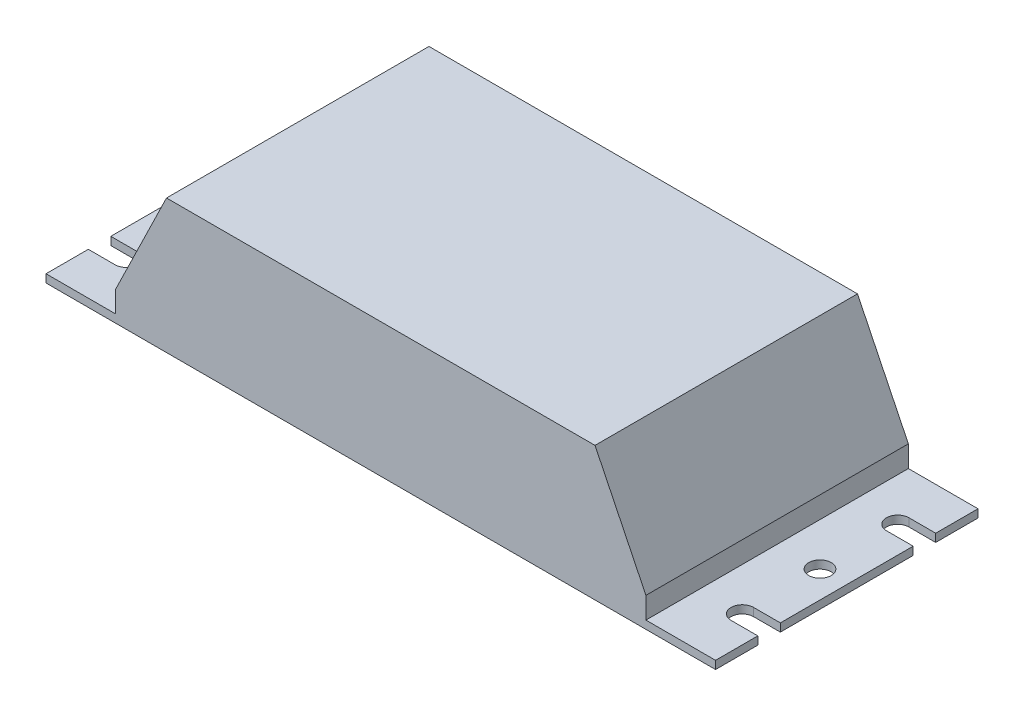
ISO-10303-21;
HEADER;
FILE_DESCRIPTION(('STEP AP214'),'2;1');
FILE_NAME('part.step','',(''),(''),'','','');
FILE_SCHEMA(('AUTOMOTIVE_DESIGN { 1 0 10303 214 1 1 1 1 }'));
ENDSEC;
DATA;
#1=APPLICATION_CONTEXT('core data for automotive mechanical design processes');
#2=APPLICATION_PROTOCOL_DEFINITION('international standard','automotive_design',2000,#1);
#3=PRODUCT_CONTEXT('',#1,'mechanical');
#4=PRODUCT('Part','Part','',(#3));
#5=PRODUCT_RELATED_PRODUCT_CATEGORY('part','',(#4));
#6=PRODUCT_DEFINITION_FORMATION('','',#4);
#7=PRODUCT_DEFINITION_CONTEXT('part definition',#1,'design');
#8=PRODUCT_DEFINITION('design','',#6,#7);
#9=PRODUCT_DEFINITION_SHAPE('','',#8);
#10=(LENGTH_UNIT() NAMED_UNIT(*) SI_UNIT(.MILLI.,.METRE.));
#11=(NAMED_UNIT(*) PLANE_ANGLE_UNIT() SI_UNIT($,.RADIAN.));
#12=(NAMED_UNIT(*) SI_UNIT($,.STERADIAN.) SOLID_ANGLE_UNIT());
#13=UNCERTAINTY_MEASURE_WITH_UNIT(LENGTH_MEASURE(1.E-05),#10,'distance_accuracy_value','');
#14=(GEOMETRIC_REPRESENTATION_CONTEXT(3) GLOBAL_UNCERTAINTY_ASSIGNED_CONTEXT((#13)) GLOBAL_UNIT_ASSIGNED_CONTEXT((#10,
#11,#12)) REPRESENTATION_CONTEXT('',''));
#15=CARTESIAN_POINT('',(0.,0.,0.));
#16=DIRECTION('',(0.,0.,1.));
#17=DIRECTION('',(1.,0.,0.));
#18=AXIS2_PLACEMENT_3D('',#15,#16,#17);
#19=CARTESIAN_POINT('',(-62.5,25.,-24.5));
#20=DIRECTION('',(1.,0.,0.));
#21=DIRECTION('',(0.,0.,-1.));
#22=AXIS2_PLACEMENT_3D('',#19,#20,#21);
#23=PLANE('',#22);
#24=DIRECTION('',(0.,0.,1.));
#25=VECTOR('',#24,1.);
#26=CARTESIAN_POINT('',(-62.5,0.,-24.5));
#27=LINE('',#26,#25);
#28=CARTESIAN_POINT('',(-62.5,0.,-24.5));
#29=VERTEX_POINT('',#28);
#30=CARTESIAN_POINT('',(-62.5,0.,-16.6));
#31=VERTEX_POINT('',#30);
#32=EDGE_CURVE('E360',#29,#31,#27,.T.);
#33=ORIENTED_EDGE('',*,*,#32,.T.);
#34=DIRECTION('',(0.,-1.,0.));
#35=VECTOR('',#34,1.);
#36=CARTESIAN_POINT('',(-62.5,25.,-16.6));
#37=LINE('',#36,#35);
#38=CARTESIAN_POINT('',(-62.5,1.5,-16.6));
#39=VERTEX_POINT('',#38);
#40=EDGE_CURVE('E234',#39,#31,#37,.T.);
#41=ORIENTED_EDGE('',*,*,#40,.F.);
#42=DIRECTION('',(0.,0.,1.));
#43=VECTOR('',#42,1.);
#44=CARTESIAN_POINT('',(-62.5,1.5,-24.5));
#45=LINE('',#44,#43);
#46=CARTESIAN_POINT('',(-62.5,1.5,-24.5));
#47=VERTEX_POINT('',#46);
#48=EDGE_CURVE('E329',#47,#39,#45,.T.);
#49=ORIENTED_EDGE('',*,*,#48,.F.);
#50=DIRECTION('',(0.,-1.,0.));
#51=VECTOR('',#50,1.);
#52=CARTESIAN_POINT('',(-62.5,25.,-24.5));
#53=LINE('',#52,#51);
#54=EDGE_CURVE('E359',#47,#29,#53,.T.);
#55=ORIENTED_EDGE('',*,*,#54,.T.);
#56=EDGE_LOOP('',(#33,#41,#49,#55));
#57=FACE_BOUND('',#56,.T.);
#58=ADVANCED_FACE('F36',(#57),#23,.F.);
#59=CARTESIAN_POINT('',(62.5,25.,-24.5));
#60=DIRECTION('',(-1.,0.,0.));
#61=DIRECTION('',(0.,0.,1.));
#62=AXIS2_PLACEMENT_3D('',#59,#60,#61);
#63=PLANE('',#62);
#64=DIRECTION('',(0.,0.,-1.));
#65=VECTOR('',#64,1.);
#66=CARTESIAN_POINT('',(62.5,0.,-24.5));
#67=LINE('',#66,#65);
#68=CARTESIAN_POINT('',(62.5,0.,12.4));
#69=VERTEX_POINT('',#68);
#70=CARTESIAN_POINT('',(62.5,0.,-12.4));
#71=VERTEX_POINT('',#70);
#72=EDGE_CURVE('E370',#69,#71,#67,.T.);
#73=ORIENTED_EDGE('',*,*,#72,.T.);
#74=DIRECTION('',(0.,-1.,0.));
#75=VECTOR('',#74,1.);
#76=CARTESIAN_POINT('',(62.5,25.,-12.4));
#77=LINE('',#76,#75);
#78=CARTESIAN_POINT('',(62.5,1.5,-12.4));
#79=VERTEX_POINT('',#78);
#80=EDGE_CURVE('E248',#79,#71,#77,.T.);
#81=ORIENTED_EDGE('',*,*,#80,.F.);
#82=DIRECTION('',(0.,0.,1.));
#83=VECTOR('',#82,1.);
#84=CARTESIAN_POINT('',(62.5,1.5,-24.5));
#85=LINE('',#84,#83);
#86=CARTESIAN_POINT('',(62.5,1.5,12.4));
#87=VERTEX_POINT('',#86);
#88=EDGE_CURVE('E351',#79,#87,#85,.T.);
#89=ORIENTED_EDGE('',*,*,#88,.T.);
#90=DIRECTION('',(0.,-1.,0.));
#91=VECTOR('',#90,1.);
#92=CARTESIAN_POINT('',(62.5,25.,12.4));
#93=LINE('',#92,#91);
#94=EDGE_CURVE('E265',#87,#69,#93,.T.);
#95=ORIENTED_EDGE('',*,*,#94,.T.);
#96=EDGE_LOOP('',(#73,#81,#89,#95));
#97=FACE_BOUND('',#96,.T.);
#98=ADVANCED_FACE('F432',(#97),#63,.F.);
#99=CARTESIAN_POINT('',(62.5,0.,24.5));
#100=VERTEX_POINT('',#99);
#101=CARTESIAN_POINT('',(62.5,0.,16.6));
#102=VERTEX_POINT('',#101);
#103=EDGE_CURVE('E367',#100,#102,#67,.T.);
#104=ORIENTED_EDGE('',*,*,#103,.T.);
#105=DIRECTION('',(0.,-1.,0.));
#106=VECTOR('',#105,1.);
#107=CARTESIAN_POINT('',(62.5,25.,16.6));
#108=LINE('',#107,#106);
#109=CARTESIAN_POINT('',(62.5,1.5,16.6));
#110=VERTEX_POINT('',#109);
#111=EDGE_CURVE('E263',#110,#102,#108,.T.);
#112=ORIENTED_EDGE('',*,*,#111,.F.);
#113=CARTESIAN_POINT('',(62.5,1.5,24.5));
#114=VERTEX_POINT('',#113);
#115=EDGE_CURVE('E311',#110,#114,#85,.T.);
#116=ORIENTED_EDGE('',*,*,#115,.T.);
#117=DIRECTION('',(0.,-1.,0.));
#118=VECTOR('',#117,1.);
#119=CARTESIAN_POINT('',(62.5,25.,24.5));
#120=LINE('',#119,#118);
#121=EDGE_CURVE('E377',#114,#100,#120,.T.);
#122=ORIENTED_EDGE('',*,*,#121,.T.);
#123=EDGE_LOOP('',(#104,#112,#116,#122));
#124=FACE_BOUND('',#123,.T.);
#125=ADVANCED_FACE('F452',(#124),#63,.F.);
#126=CARTESIAN_POINT('',(-62.5,1.5,16.6));
#127=VERTEX_POINT('',#126);
#128=CARTESIAN_POINT('',(-62.5,1.5,24.5));
#129=VERTEX_POINT('',#128);
#130=EDGE_CURVE('E334',#127,#129,#45,.T.);
#131=ORIENTED_EDGE('',*,*,#130,.F.);
#132=DIRECTION('',(0.,-1.,0.));
#133=VECTOR('',#132,1.);
#134=CARTESIAN_POINT('',(-62.5,25.,16.6));
#135=LINE('',#134,#133);
#136=CARTESIAN_POINT('',(-62.5,0.,16.6));
#137=VERTEX_POINT('',#136);
#138=EDGE_CURVE('E277',#127,#137,#135,.T.);
#139=ORIENTED_EDGE('',*,*,#138,.T.);
#140=CARTESIAN_POINT('',(-62.5,0.,24.5));
#141=VERTEX_POINT('',#140);
#142=EDGE_CURVE('E332',#137,#141,#27,.T.);
#143=ORIENTED_EDGE('',*,*,#142,.T.);
#144=DIRECTION('',(0.,-1.,0.));
#145=VECTOR('',#144,1.);
#146=CARTESIAN_POINT('',(-62.5,25.,24.5));
#147=LINE('',#146,#145);
#148=EDGE_CURVE('E379',#129,#141,#147,.T.);
#149=ORIENTED_EDGE('',*,*,#148,.F.);
#150=EDGE_LOOP('',(#131,#139,#143,#149));
#151=FACE_BOUND('',#150,.T.);
#152=ADVANCED_FACE('F483',(#151),#23,.F.);
#153=CARTESIAN_POINT('',(-62.5,1.5,-12.4));
#154=VERTEX_POINT('',#153);
#155=CARTESIAN_POINT('',(-62.5,1.5,12.4));
#156=VERTEX_POINT('',#155);
#157=EDGE_CURVE('E333',#154,#156,#45,.T.);
#158=ORIENTED_EDGE('',*,*,#157,.F.);
#159=DIRECTION('',(0.,-1.,0.));
#160=VECTOR('',#159,1.);
#161=CARTESIAN_POINT('',(-62.5,25.,-12.4));
#162=LINE('',#161,#160);
#163=CARTESIAN_POINT('',(-62.5,0.,-12.4));
#164=VERTEX_POINT('',#163);
#165=EDGE_CURVE('E51',#154,#164,#162,.T.);
#166=ORIENTED_EDGE('',*,*,#165,.T.);
#167=CARTESIAN_POINT('',(-62.5,0.,12.4));
#168=VERTEX_POINT('',#167);
#169=EDGE_CURVE('E228',#164,#168,#27,.T.);
#170=ORIENTED_EDGE('',*,*,#169,.T.);
#171=DIRECTION('',(0.,-1.,0.));
#172=VECTOR('',#171,1.);
#173=CARTESIAN_POINT('',(-62.5,25.,12.4));
#174=LINE('',#173,#172);
#175=EDGE_CURVE('E276',#156,#168,#174,.T.);
#176=ORIENTED_EDGE('',*,*,#175,.F.);
#177=EDGE_LOOP('',(#158,#166,#170,#176));
#178=FACE_BOUND('',#177,.T.);
#179=ADVANCED_FACE('F38',(#178),#23,.F.);
#180=CARTESIAN_POINT('',(-62.5,25.,24.5));
#181=DIRECTION('',(0.,0.,-1.));
#182=DIRECTION('',(-1.,0.,0.));
#183=AXIS2_PLACEMENT_3D('',#180,#181,#182);
#184=PLANE('',#183);
#185=DIRECTION('',(-1.,0.,0.));
#186=VECTOR('',#185,1.);
#187=CARTESIAN_POINT('',(-62.5,1.5,24.5));
#188=LINE('',#187,#186);
#189=CARTESIAN_POINT('',(-49.5,1.5,24.5));
#190=VERTEX_POINT('',#189);
#191=EDGE_CURVE('E298',#190,#129,#188,.T.);
#192=ORIENTED_EDGE('',*,*,#191,.T.);
#193=ORIENTED_EDGE('',*,*,#148,.T.);
#194=DIRECTION('',(1.,0.,0.));
#195=VECTOR('',#194,1.);
#196=CARTESIAN_POINT('',(-62.5,0.,24.5));
#197=LINE('',#196,#195);
#198=EDGE_CURVE('E363',#141,#100,#197,.T.);
#199=ORIENTED_EDGE('',*,*,#198,.T.);
#200=ORIENTED_EDGE('',*,*,#121,.F.);
#201=DIRECTION('',(-1.,0.,0.));
#202=VECTOR('',#201,1.);
#203=CARTESIAN_POINT('',(62.5,1.5,24.5));
#204=LINE('',#203,#202);
#205=CARTESIAN_POINT('',(49.5,1.5,24.5));
#206=VERTEX_POINT('',#205);
#207=EDGE_CURVE('E312',#114,#206,#204,.T.);
#208=ORIENTED_EDGE('',*,*,#207,.T.);
#209=DIRECTION('',(0.,1.,0.));
#210=VECTOR('',#209,1.);
#211=CARTESIAN_POINT('',(49.5,1.5,24.5));
#212=LINE('',#211,#210);
#213=CARTESIAN_POINT('',(49.5,5.5,24.5));
#214=VERTEX_POINT('',#213);
#215=EDGE_CURVE('E315',#206,#214,#212,.T.);
#216=ORIENTED_EDGE('',*,*,#215,.T.);
#217=DIRECTION('',(-0.437969423279695,0.89898986883727,0.));
#218=VECTOR('',#217,1.);
#219=CARTESIAN_POINT('',(49.5,5.5,24.5));
#220=LINE('',#219,#218);
#221=CARTESIAN_POINT('',(40.,25.,24.5));
#222=VERTEX_POINT('',#221);
#223=EDGE_CURVE('E318',#214,#222,#220,.T.);
#224=ORIENTED_EDGE('',*,*,#223,.T.);
#225=DIRECTION('',(1.,0.,0.));
#226=VECTOR('',#225,1.);
#227=CARTESIAN_POINT('',(-62.5,25.,24.5));
#228=LINE('',#227,#226);
#229=CARTESIAN_POINT('',(-40.,25.,24.5));
#230=VERTEX_POINT('',#229);
#231=EDGE_CURVE('E352',#230,#222,#228,.T.);
#232=ORIENTED_EDGE('',*,*,#231,.F.);
#233=DIRECTION('',(-0.437969423279695,-0.89898986883727,0.));
#234=VECTOR('',#233,1.);
#235=CARTESIAN_POINT('',(-49.5,5.5,24.5));
#236=LINE('',#235,#234);
#237=CARTESIAN_POINT('',(-49.5,5.5,24.5));
#238=VERTEX_POINT('',#237);
#239=EDGE_CURVE('E321',#230,#238,#236,.T.);
#240=ORIENTED_EDGE('',*,*,#239,.T.);
#241=DIRECTION('',(0.,-1.,0.));
#242=VECTOR('',#241,1.);
#243=CARTESIAN_POINT('',(-49.5,1.5,24.5));
#244=LINE('',#243,#242);
#245=EDGE_CURVE('E324',#238,#190,#244,.T.);
#246=ORIENTED_EDGE('',*,*,#245,.T.);
#247=EDGE_LOOP('',(#192,#193,#199,#200,#208,#216,#224,#232,#240,#246));
#248=FACE_BOUND('',#247,.T.);
#249=ADVANCED_FACE('F457',(#248),#184,.F.);
#250=CARTESIAN_POINT('',(62.5,1.5,-24.5));
#251=VERTEX_POINT('',#250);
#252=CARTESIAN_POINT('',(62.5,1.5,-16.6));
#253=VERTEX_POINT('',#252);
#254=EDGE_CURVE('E348',#251,#253,#85,.T.);
#255=ORIENTED_EDGE('',*,*,#254,.T.);
#256=DIRECTION('',(0.,-1.,0.));
#257=VECTOR('',#256,1.);
#258=CARTESIAN_POINT('',(62.5,25.,-16.6));
#259=LINE('',#258,#257);
#260=CARTESIAN_POINT('',(62.5,0.,-16.6));
#261=VERTEX_POINT('',#260);
#262=EDGE_CURVE('E59',#253,#261,#259,.T.);
#263=ORIENTED_EDGE('',*,*,#262,.T.);
#264=CARTESIAN_POINT('',(62.5,0.,-24.5));
#265=VERTEX_POINT('',#264);
#266=EDGE_CURVE('E366',#261,#265,#67,.T.);
#267=ORIENTED_EDGE('',*,*,#266,.T.);
#268=DIRECTION('',(0.,-1.,0.));
#269=VECTOR('',#268,1.);
#270=CARTESIAN_POINT('',(62.5,25.,-24.5));
#271=LINE('',#270,#269);
#272=EDGE_CURVE('E374',#251,#265,#271,.T.);
#273=ORIENTED_EDGE('',*,*,#272,.F.);
#274=EDGE_LOOP('',(#255,#263,#267,#273));
#275=FACE_BOUND('',#274,.T.);
#276=ADVANCED_FACE('F489',(#275),#63,.F.);
#277=CARTESIAN_POINT('',(-62.5,25.,-24.5));
#278=DIRECTION('',(0.,0.,1.));
#279=DIRECTION('',(1.,0.,0.));
#280=AXIS2_PLACEMENT_3D('',#277,#278,#279);
#281=PLANE('',#280);
#282=DIRECTION('',(-1.,0.,0.));
#283=VECTOR('',#282,1.);
#284=CARTESIAN_POINT('',(-62.5,1.5,-24.5));
#285=LINE('',#284,#283);
#286=CARTESIAN_POINT('',(-49.5,1.5,-24.5));
#287=VERTEX_POINT('',#286);
#288=EDGE_CURVE('E309',#287,#47,#285,.T.);
#289=ORIENTED_EDGE('',*,*,#288,.F.);
#290=DIRECTION('',(0.,-1.,0.));
#291=VECTOR('',#290,1.);
#292=CARTESIAN_POINT('',(-49.5,1.5,-24.5));
#293=LINE('',#292,#291);
#294=CARTESIAN_POINT('',(-49.5,5.5,-24.5));
#295=VERTEX_POINT('',#294);
#296=EDGE_CURVE('E306',#295,#287,#293,.T.);
#297=ORIENTED_EDGE('',*,*,#296,.F.);
#298=DIRECTION('',(-0.437969423279695,-0.89898986883727,0.));
#299=VECTOR('',#298,1.);
#300=CARTESIAN_POINT('',(-49.5,5.5,-24.5));
#301=LINE('',#300,#299);
#302=CARTESIAN_POINT('',(-40.,25.,-24.5));
#303=VERTEX_POINT('',#302);
#304=EDGE_CURVE('E303',#303,#295,#301,.T.);
#305=ORIENTED_EDGE('',*,*,#304,.F.);
#306=DIRECTION('',(-1.,0.,0.));
#307=VECTOR('',#306,1.);
#308=CARTESIAN_POINT('',(-62.5,25.,-24.5));
#309=LINE('',#308,#307);
#310=CARTESIAN_POINT('',(40.,25.,-24.5));
#311=VERTEX_POINT('',#310);
#312=EDGE_CURVE('E355',#311,#303,#309,.T.);
#313=ORIENTED_EDGE('',*,*,#312,.F.);
#314=DIRECTION('',(-0.437969423279695,0.89898986883727,0.));
#315=VECTOR('',#314,1.);
#316=CARTESIAN_POINT('',(49.5,5.5,-24.5));
#317=LINE('',#316,#315);
#318=CARTESIAN_POINT('',(49.5,5.5,-24.5));
#319=VERTEX_POINT('',#318);
#320=EDGE_CURVE('E301',#319,#311,#317,.T.);
#321=ORIENTED_EDGE('',*,*,#320,.F.);
#322=DIRECTION('',(0.,1.,0.));
#323=VECTOR('',#322,1.);
#324=CARTESIAN_POINT('',(49.5,1.5,-24.5));
#325=LINE('',#324,#323);
#326=CARTESIAN_POINT('',(49.5,1.5,-24.5));
#327=VERTEX_POINT('',#326);
#328=EDGE_CURVE('E297',#327,#319,#325,.T.);
#329=ORIENTED_EDGE('',*,*,#328,.F.);
#330=DIRECTION('',(-1.,0.,0.));
#331=VECTOR('',#330,1.);
#332=CARTESIAN_POINT('',(62.5,1.5,-24.5));
#333=LINE('',#332,#331);
#334=EDGE_CURVE('E294',#251,#327,#333,.T.);
#335=ORIENTED_EDGE('',*,*,#334,.F.);
#336=ORIENTED_EDGE('',*,*,#272,.T.);
#337=DIRECTION('',(-1.,0.,0.));
#338=VECTOR('',#337,1.);
#339=CARTESIAN_POINT('',(-62.5,0.,-24.5));
#340=LINE('',#339,#338);
#341=EDGE_CURVE('E356',#265,#29,#340,.T.);
#342=ORIENTED_EDGE('',*,*,#341,.T.);
#343=ORIENTED_EDGE('',*,*,#54,.F.);
#344=EDGE_LOOP('',(#289,#297,#305,#313,#321,#329,#335,#336,#342,#343));
#345=FACE_BOUND('',#344,.T.);
#346=ADVANCED_FACE('F418',(#345),#281,.F.);
#347=CARTESIAN_POINT('',(0.,25.,0.));
#348=DIRECTION('',(0.,1.,0.));
#349=DIRECTION('',(0.,0.,1.));
#350=AXIS2_PLACEMENT_3D('',#347,#348,#349);
#351=PLANE('',#350);
#352=ORIENTED_EDGE('',*,*,#312,.T.);
#353=DIRECTION('',(0.,0.,1.));
#354=VECTOR('',#353,1.);
#355=CARTESIAN_POINT('',(-40.,25.,-24.5));
#356=LINE('',#355,#354);
#357=EDGE_CURVE('E339',#303,#230,#356,.T.);
#358=ORIENTED_EDGE('',*,*,#357,.T.);
#359=ORIENTED_EDGE('',*,*,#231,.T.);
#360=DIRECTION('',(0.,0.,1.));
#361=VECTOR('',#360,1.);
#362=CARTESIAN_POINT('',(40.,25.,-24.5));
#363=LINE('',#362,#361);
#364=EDGE_CURVE('E342',#311,#222,#363,.T.);
#365=ORIENTED_EDGE('',*,*,#364,.F.);
#366=EDGE_LOOP('',(#352,#358,#359,#365));
#367=FACE_BOUND('',#366,.T.);
#368=ADVANCED_FACE('F552',(#367),#351,.T.);
#369=CARTESIAN_POINT('',(0.,0.,0.));
#370=DIRECTION('',(0.,1.,0.));
#371=DIRECTION('',(0.,0.,1.));
#372=AXIS2_PLACEMENT_3D('',#369,#370,#371);
#373=PLANE('',#372);
#374=CARTESIAN_POINT('',(57.5,0.,0.));
#375=DIRECTION('',(0.,-1.,0.));
#376=DIRECTION('',(0.,0.,1.));
#377=AXIS2_PLACEMENT_3D('',#374,#375,#376);
#378=CIRCLE('',#377,2.1);
#379=CARTESIAN_POINT('',(57.5,0.,2.10000000000001));
#380=VERTEX_POINT('',#379);
#381=EDGE_CURVE('E280',#380,#380,#378,.T.);
#382=ORIENTED_EDGE('',*,*,#381,.F.);
#383=EDGE_LOOP('',(#382));
#384=FACE_BOUND('',#383,.T.);
#385=CARTESIAN_POINT('',(-57.5,0.,0.));
#386=DIRECTION('',(0.,-1.,0.));
#387=DIRECTION('',(0.,0.,-1.));
#388=AXIS2_PLACEMENT_3D('',#385,#386,#387);
#389=CIRCLE('',#388,2.1);
#390=CARTESIAN_POINT('',(-57.5,0.,-2.1));
#391=VERTEX_POINT('',#390);
#392=EDGE_CURVE('E290',#391,#391,#389,.T.);
#393=ORIENTED_EDGE('',*,*,#392,.F.);
#394=EDGE_LOOP('',(#393));
#395=FACE_BOUND('',#394,.T.);
#396=CARTESIAN_POINT('',(-57.5,0.,-14.5));
#397=DIRECTION('',(0.,-1.,0.));
#398=DIRECTION('',(0.,0.,-1.));
#399=AXIS2_PLACEMENT_3D('',#396,#397,#398);
#400=CIRCLE('',#399,2.1);
#401=CARTESIAN_POINT('',(-57.5,0.,-16.6));
#402=VERTEX_POINT('',#401);
#403=CARTESIAN_POINT('',(-57.5,0.,-12.4));
#404=VERTEX_POINT('',#403);
#405=EDGE_CURVE('E217',#402,#404,#400,.T.);
#406=ORIENTED_EDGE('',*,*,#405,.F.);
#407=DIRECTION('',(1.,0.,0.));
#408=VECTOR('',#407,1.);
#409=CARTESIAN_POINT('',(-62.5,0.,-16.6));
#410=LINE('',#409,#408);
#411=EDGE_CURVE('E214',#31,#402,#410,.T.);
#412=ORIENTED_EDGE('',*,*,#411,.F.);
#413=ORIENTED_EDGE('',*,*,#32,.F.);
#414=ORIENTED_EDGE('',*,*,#341,.F.);
#415=ORIENTED_EDGE('',*,*,#266,.F.);
#416=DIRECTION('',(1.,0.,0.));
#417=VECTOR('',#416,1.);
#418=CARTESIAN_POINT('',(62.5,0.,-16.6));
#419=LINE('',#418,#417);
#420=CARTESIAN_POINT('',(57.5,0.,-16.6));
#421=VERTEX_POINT('',#420);
#422=EDGE_CURVE('E239',#421,#261,#419,.T.);
#423=ORIENTED_EDGE('',*,*,#422,.F.);
#424=CARTESIAN_POINT('',(57.5,0.,-14.5));
#425=DIRECTION('',(0.,-1.,0.));
#426=DIRECTION('',(0.,0.,1.));
#427=AXIS2_PLACEMENT_3D('',#424,#425,#426);
#428=CIRCLE('',#427,2.10000000000001);
#429=CARTESIAN_POINT('',(57.5,0.,-12.4));
#430=VERTEX_POINT('',#429);
#431=EDGE_CURVE('E233',#430,#421,#428,.T.);
#432=ORIENTED_EDGE('',*,*,#431,.F.);
#433=DIRECTION('',(-1.,0.,0.));
#434=VECTOR('',#433,1.);
#435=CARTESIAN_POINT('',(62.5,0.,-12.4));
#436=LINE('',#435,#434);
#437=EDGE_CURVE('E241',#71,#430,#436,.T.);
#438=ORIENTED_EDGE('',*,*,#437,.F.);
#439=ORIENTED_EDGE('',*,*,#72,.F.);
#440=DIRECTION('',(1.,0.,0.));
#441=VECTOR('',#440,1.);
#442=CARTESIAN_POINT('',(62.5,0.,12.4));
#443=LINE('',#442,#441);
#444=CARTESIAN_POINT('',(57.5,0.,12.4));
#445=VERTEX_POINT('',#444);
#446=EDGE_CURVE('E254',#445,#69,#443,.T.);
#447=ORIENTED_EDGE('',*,*,#446,.F.);
#448=CARTESIAN_POINT('',(57.5,0.,14.5));
#449=DIRECTION('',(0.,-1.,0.));
#450=DIRECTION('',(0.,0.,-1.));
#451=AXIS2_PLACEMENT_3D('',#448,#449,#450);
#452=CIRCLE('',#451,2.1);
#453=CARTESIAN_POINT('',(57.5,0.,16.6));
#454=VERTEX_POINT('',#453);
#455=EDGE_CURVE('E247',#454,#445,#452,.T.);
#456=ORIENTED_EDGE('',*,*,#455,.F.);
#457=DIRECTION('',(-1.,0.,0.));
#458=VECTOR('',#457,1.);
#459=CARTESIAN_POINT('',(62.5,0.,16.6));
#460=LINE('',#459,#458);
#461=EDGE_CURVE('E256',#102,#454,#460,.T.);
#462=ORIENTED_EDGE('',*,*,#461,.F.);
#463=ORIENTED_EDGE('',*,*,#103,.F.);
#464=ORIENTED_EDGE('',*,*,#198,.F.);
#465=ORIENTED_EDGE('',*,*,#142,.F.);
#466=DIRECTION('',(-1.,0.,0.));
#467=VECTOR('',#466,1.);
#468=CARTESIAN_POINT('',(-62.5,0.,16.6));
#469=LINE('',#468,#467);
#470=CARTESIAN_POINT('',(-57.5,0.,16.6));
#471=VERTEX_POINT('',#470);
#472=EDGE_CURVE('E274',#471,#137,#469,.T.);
#473=ORIENTED_EDGE('',*,*,#472,.F.);
#474=CARTESIAN_POINT('',(-57.5,0.,14.5));
#475=DIRECTION('',(0.,-1.,0.));
#476=DIRECTION('',(0.,0.,1.));
#477=AXIS2_PLACEMENT_3D('',#474,#475,#476);
#478=CIRCLE('',#477,2.1);
#479=CARTESIAN_POINT('',(-57.5,0.,12.4));
#480=VERTEX_POINT('',#479);
#481=EDGE_CURVE('E271',#480,#471,#478,.T.);
#482=ORIENTED_EDGE('',*,*,#481,.F.);
#483=DIRECTION('',(1.,0.,0.));
#484=VECTOR('',#483,1.);
#485=CARTESIAN_POINT('',(-62.5,0.,12.4));
#486=LINE('',#485,#484);
#487=EDGE_CURVE('E262',#168,#480,#486,.T.);
#488=ORIENTED_EDGE('',*,*,#487,.F.);
#489=ORIENTED_EDGE('',*,*,#169,.F.);
#490=DIRECTION('',(-1.,0.,0.));
#491=VECTOR('',#490,1.);
#492=CARTESIAN_POINT('',(-62.5,0.,-12.4));
#493=LINE('',#492,#491);
#494=EDGE_CURVE('E210',#404,#164,#493,.T.);
#495=ORIENTED_EDGE('',*,*,#494,.F.);
#496=EDGE_LOOP('',(#406,#412,#413,#414,#415,#423,#432,#438,#439,#447,#456,#462,#463,#464,#465,
#473,#482,#488,#489,#495));
#497=FACE_BOUND('',#496,.T.);
#498=ADVANCED_FACE('F226',(#384,#395,#497),#373,.F.);
#499=CARTESIAN_POINT('',(62.5,1.5,-24.5));
#500=DIRECTION('',(0.,1.,0.));
#501=DIRECTION('',(-1.,0.,0.));
#502=AXIS2_PLACEMENT_3D('',#499,#500,#501);
#503=PLANE('',#502);
#504=DIRECTION('',(1.,0.,0.));
#505=VECTOR('',#504,1.);
#506=CARTESIAN_POINT('',(62.5000000000001,1.5,-12.4));
#507=LINE('',#506,#505);
#508=CARTESIAN_POINT('',(57.5,1.5,-12.4));
#509=VERTEX_POINT('',#508);
#510=EDGE_CURVE('E404',#509,#79,#507,.T.);
#511=ORIENTED_EDGE('',*,*,#510,.F.);
#512=CARTESIAN_POINT('',(57.5,1.5,-14.5));
#513=DIRECTION('',(0.,1.,0.));
#514=DIRECTION('',(-1.,0.,0.));
#515=AXIS2_PLACEMENT_3D('',#512,#513,#514);
#516=CIRCLE('',#515,2.10000000000001);
#517=CARTESIAN_POINT('',(57.5,1.5,-16.6));
#518=VERTEX_POINT('',#517);
#519=EDGE_CURVE('E402',#518,#509,#516,.T.);
#520=ORIENTED_EDGE('',*,*,#519,.F.);
#521=DIRECTION('',(-1.,0.,0.));
#522=VECTOR('',#521,1.);
#523=CARTESIAN_POINT('',(62.5,1.5,-16.6));
#524=LINE('',#523,#522);
#525=EDGE_CURVE('E400',#253,#518,#524,.T.);
#526=ORIENTED_EDGE('',*,*,#525,.F.);
#527=ORIENTED_EDGE('',*,*,#254,.F.);
#528=ORIENTED_EDGE('',*,*,#334,.T.);
#529=DIRECTION('',(0.,0.,1.));
#530=VECTOR('',#529,1.);
#531=CARTESIAN_POINT('',(49.5,1.5,-24.5));
#532=LINE('',#531,#530);
#533=EDGE_CURVE('E346',#327,#206,#532,.T.);
#534=ORIENTED_EDGE('',*,*,#533,.T.);
#535=ORIENTED_EDGE('',*,*,#207,.F.);
#536=ORIENTED_EDGE('',*,*,#115,.F.);
#537=DIRECTION('',(1.,0.,0.));
#538=VECTOR('',#537,1.);
#539=CARTESIAN_POINT('',(62.5000000000002,1.5,16.6));
#540=LINE('',#539,#538);
#541=CARTESIAN_POINT('',(57.5,1.5,16.6));
#542=VERTEX_POINT('',#541);
#543=EDGE_CURVE('E398',#542,#110,#540,.T.);
#544=ORIENTED_EDGE('',*,*,#543,.F.);
#545=CARTESIAN_POINT('',(57.5,1.5,14.5));
#546=DIRECTION('',(0.,1.,0.));
#547=DIRECTION('',(-1.,0.,0.));
#548=AXIS2_PLACEMENT_3D('',#545,#546,#547);
#549=CIRCLE('',#548,2.1);
#550=CARTESIAN_POINT('',(57.5,1.5,12.4));
#551=VERTEX_POINT('',#550);
#552=EDGE_CURVE('E396',#551,#542,#549,.T.);
#553=ORIENTED_EDGE('',*,*,#552,.F.);
#554=DIRECTION('',(-1.,0.,0.));
#555=VECTOR('',#554,1.);
#556=CARTESIAN_POINT('',(62.5,1.5,12.4));
#557=LINE('',#556,#555);
#558=EDGE_CURVE('E394',#87,#551,#557,.T.);
#559=ORIENTED_EDGE('',*,*,#558,.F.);
#560=ORIENTED_EDGE('',*,*,#88,.F.);
#561=EDGE_LOOP('',(#511,#520,#526,#527,#528,#534,#535,#536,#544,#553,#559,#560));
#562=FACE_BOUND('',#561,.T.);
#563=CARTESIAN_POINT('',(57.5,1.5,0.));
#564=DIRECTION('',(0.,1.,0.));
#565=DIRECTION('',(-1.,0.,0.));
#566=AXIS2_PLACEMENT_3D('',#563,#564,#565);
#567=CIRCLE('',#566,2.1);
#568=CARTESIAN_POINT('',(55.4,1.5,0.));
#569=VERTEX_POINT('',#568);
#570=EDGE_CURVE('E289',#569,#569,#567,.T.);
#571=ORIENTED_EDGE('',*,*,#570,.F.);
#572=EDGE_LOOP('',(#571));
#573=FACE_BOUND('',#572,.T.);
#574=ADVANCED_FACE('F444',(#562,#573),#503,.T.);
#575=CARTESIAN_POINT('',(49.5,5.5,-24.5));
#576=DIRECTION('',(0.89898986883727,0.437969423279695,0.));
#577=DIRECTION('',(-0.437969423279695,0.89898986883727,0.));
#578=AXIS2_PLACEMENT_3D('',#575,#576,#577);
#579=PLANE('',#578);
#580=ORIENTED_EDGE('',*,*,#223,.F.);
#581=DIRECTION('',(0.,0.,1.));
#582=VECTOR('',#581,1.);
#583=CARTESIAN_POINT('',(49.5,5.5,-24.5));
#584=LINE('',#583,#582);
#585=EDGE_CURVE('E344',#319,#214,#584,.T.);
#586=ORIENTED_EDGE('',*,*,#585,.F.);
#587=ORIENTED_EDGE('',*,*,#320,.T.);
#588=ORIENTED_EDGE('',*,*,#364,.T.);
#589=EDGE_LOOP('',(#580,#586,#587,#588));
#590=FACE_BOUND('',#589,.T.);
#591=ADVANCED_FACE('F543',(#590),#579,.T.);
#592=CARTESIAN_POINT('',(49.5,1.5,-24.5));
#593=DIRECTION('',(1.,0.,0.));
#594=DIRECTION('',(0.,0.,-1.));
#595=AXIS2_PLACEMENT_3D('',#592,#593,#594);
#596=PLANE('',#595);
#597=ORIENTED_EDGE('',*,*,#215,.F.);
#598=ORIENTED_EDGE('',*,*,#533,.F.);
#599=ORIENTED_EDGE('',*,*,#328,.T.);
#600=ORIENTED_EDGE('',*,*,#585,.T.);
#601=EDGE_LOOP('',(#597,#598,#599,#600));
#602=FACE_BOUND('',#601,.T.);
#603=ADVANCED_FACE('F536',(#602),#596,.T.);
#604=CARTESIAN_POINT('',(-62.5,1.5,-24.5));
#605=DIRECTION('',(0.,1.,0.));
#606=DIRECTION('',(-1.,0.,0.));
#607=AXIS2_PLACEMENT_3D('',#604,#605,#606);
#608=PLANE('',#607);
#609=DIRECTION('',(-1.,0.,0.));
#610=VECTOR('',#609,1.);
#611=CARTESIAN_POINT('',(-62.5,1.5,-16.6));
#612=LINE('',#611,#610);
#613=CARTESIAN_POINT('',(-57.5,1.5,-16.6));
#614=VERTEX_POINT('',#613);
#615=EDGE_CURVE('E12',#614,#39,#612,.T.);
#616=ORIENTED_EDGE('',*,*,#615,.F.);
#617=CARTESIAN_POINT('',(-57.5,1.5,-14.5));
#618=DIRECTION('',(0.,1.,0.));
#619=DIRECTION('',(-1.,0.,0.));
#620=AXIS2_PLACEMENT_3D('',#617,#618,#619);
#621=CIRCLE('',#620,2.1);
#622=CARTESIAN_POINT('',(-57.5,1.5,-12.4));
#623=VERTEX_POINT('',#622);
#624=EDGE_CURVE('E44',#623,#614,#621,.T.);
#625=ORIENTED_EDGE('',*,*,#624,.F.);
#626=DIRECTION('',(1.,0.,0.));
#627=VECTOR('',#626,1.);
#628=CARTESIAN_POINT('',(-62.5,1.5,-12.4));
#629=LINE('',#628,#627);
#630=EDGE_CURVE('E211',#154,#623,#629,.T.);
#631=ORIENTED_EDGE('',*,*,#630,.F.);
#632=ORIENTED_EDGE('',*,*,#157,.T.);
#633=DIRECTION('',(-1.,0.,0.));
#634=VECTOR('',#633,1.);
#635=CARTESIAN_POINT('',(-62.5,1.5,12.4));
#636=LINE('',#635,#634);
#637=CARTESIAN_POINT('',(-57.5,1.5,12.4));
#638=VERTEX_POINT('',#637);
#639=EDGE_CURVE('E382',#638,#156,#636,.T.);
#640=ORIENTED_EDGE('',*,*,#639,.F.);
#641=CARTESIAN_POINT('',(-57.5,1.5,14.5));
#642=DIRECTION('',(0.,1.,0.));
#643=DIRECTION('',(-1.,0.,0.));
#644=AXIS2_PLACEMENT_3D('',#641,#642,#643);
#645=CIRCLE('',#644,2.1);
#646=CARTESIAN_POINT('',(-57.5,1.5,16.6));
#647=VERTEX_POINT('',#646);
#648=EDGE_CURVE('E389',#647,#638,#645,.T.);
#649=ORIENTED_EDGE('',*,*,#648,.F.);
#650=DIRECTION('',(1.,0.,0.));
#651=VECTOR('',#650,1.);
#652=CARTESIAN_POINT('',(-62.5000000000002,1.5,16.6));
#653=LINE('',#652,#651);
#654=EDGE_CURVE('E392',#127,#647,#653,.T.);
#655=ORIENTED_EDGE('',*,*,#654,.F.);
#656=ORIENTED_EDGE('',*,*,#130,.T.);
#657=ORIENTED_EDGE('',*,*,#191,.F.);
#658=DIRECTION('',(0.,0.,1.));
#659=VECTOR('',#658,1.);
#660=CARTESIAN_POINT('',(-49.5,1.5,-24.5));
#661=LINE('',#660,#659);
#662=EDGE_CURVE('E335',#287,#190,#661,.T.);
#663=ORIENTED_EDGE('',*,*,#662,.F.);
#664=ORIENTED_EDGE('',*,*,#288,.T.);
#665=ORIENTED_EDGE('',*,*,#48,.T.);
#666=EDGE_LOOP('',(#616,#625,#631,#632,#640,#649,#655,#656,#657,#663,#664,#665));
#667=FACE_BOUND('',#666,.T.);
#668=CARTESIAN_POINT('',(-57.5,1.5,0.));
#669=DIRECTION('',(0.,1.,0.));
#670=DIRECTION('',(-1.,0.,0.));
#671=AXIS2_PLACEMENT_3D('',#668,#669,#670);
#672=CIRCLE('',#671,2.1);
#673=CARTESIAN_POINT('',(-59.6,1.5,0.));
#674=VERTEX_POINT('',#673);
#675=EDGE_CURVE('E293',#674,#674,#672,.T.);
#676=ORIENTED_EDGE('',*,*,#675,.F.);
#677=EDGE_LOOP('',(#676));
#678=FACE_BOUND('',#677,.T.);
#679=ADVANCED_FACE('F411',(#667,#678),#608,.T.);
#680=CARTESIAN_POINT('',(-49.5,1.5,-24.5));
#681=DIRECTION('',(-1.,0.,0.));
#682=DIRECTION('',(0.,0.,1.));
#683=AXIS2_PLACEMENT_3D('',#680,#681,#682);
#684=PLANE('',#683);
#685=ORIENTED_EDGE('',*,*,#245,.F.);
#686=DIRECTION('',(0.,0.,1.));
#687=VECTOR('',#686,1.);
#688=CARTESIAN_POINT('',(-49.5,5.5,-24.5));
#689=LINE('',#688,#687);
#690=EDGE_CURVE('E337',#295,#238,#689,.T.);
#691=ORIENTED_EDGE('',*,*,#690,.F.);
#692=ORIENTED_EDGE('',*,*,#296,.T.);
#693=ORIENTED_EDGE('',*,*,#662,.T.);
#694=EDGE_LOOP('',(#685,#691,#692,#693));
#695=FACE_BOUND('',#694,.T.);
#696=ADVANCED_FACE('F535',(#695),#684,.T.);
#697=CARTESIAN_POINT('',(-49.5,5.5,-24.5));
#698=DIRECTION('',(-0.89898986883727,0.437969423279695,0.));
#699=DIRECTION('',(-0.437969423279695,-0.89898986883727,0.));
#700=AXIS2_PLACEMENT_3D('',#697,#698,#699);
#701=PLANE('',#700);
#702=ORIENTED_EDGE('',*,*,#239,.F.);
#703=ORIENTED_EDGE('',*,*,#357,.F.);
#704=ORIENTED_EDGE('',*,*,#304,.T.);
#705=ORIENTED_EDGE('',*,*,#690,.T.);
#706=EDGE_LOOP('',(#702,#703,#704,#705));
#707=FACE_BOUND('',#706,.T.);
#708=ADVANCED_FACE('F531',(#707),#701,.T.);
#709=CARTESIAN_POINT('',(-57.5,25.,0.));
#710=DIRECTION('',(0.,-1.,0.));
#711=DIRECTION('',(0.,0.,-1.));
#712=AXIS2_PLACEMENT_3D('',#709,#710,#711);
#713=CYLINDRICAL_SURFACE('',#712,2.1);
#714=ORIENTED_EDGE('',*,*,#675,.T.);
#715=EDGE_LOOP('',(#714));
#716=FACE_BOUND('',#715,.T.);
#717=ORIENTED_EDGE('',*,*,#392,.T.);
#718=EDGE_LOOP('',(#717));
#719=FACE_BOUND('',#718,.T.);
#720=ADVANCED_FACE('F523',(#716,#719),#713,.F.);
#721=CARTESIAN_POINT('',(57.5,25.,0.));
#722=DIRECTION('',(0.,-1.,0.));
#723=DIRECTION('',(0.,0.,-1.));
#724=AXIS2_PLACEMENT_3D('',#721,#722,#723);
#725=CYLINDRICAL_SURFACE('',#724,2.1);
#726=ORIENTED_EDGE('',*,*,#570,.T.);
#727=EDGE_LOOP('',(#726));
#728=FACE_BOUND('',#727,.T.);
#729=ORIENTED_EDGE('',*,*,#381,.T.);
#730=EDGE_LOOP('',(#729));
#731=FACE_BOUND('',#730,.T.);
#732=ADVANCED_FACE('F516',(#728,#731),#725,.F.);
#733=CARTESIAN_POINT('',(-62.5,25.,16.6));
#734=DIRECTION('',(0.,0.,1.));
#735=DIRECTION('',(1.,0.,0.));
#736=AXIS2_PLACEMENT_3D('',#733,#734,#735);
#737=PLANE('',#736);
#738=ORIENTED_EDGE('',*,*,#654,.T.);
#739=DIRECTION('',(0.,-1.,0.));
#740=VECTOR('',#739,1.);
#741=CARTESIAN_POINT('',(-57.5,25.,16.6));
#742=LINE('',#741,#740);
#743=EDGE_CURVE('E281',#647,#471,#742,.T.);
#744=ORIENTED_EDGE('',*,*,#743,.T.);
#745=ORIENTED_EDGE('',*,*,#472,.T.);
#746=ORIENTED_EDGE('',*,*,#138,.F.);
#747=EDGE_LOOP('',(#738,#744,#745,#746));
#748=FACE_BOUND('',#747,.T.);
#749=ADVANCED_FACE('F514',(#748),#737,.F.);
#750=CARTESIAN_POINT('',(-57.5,25.,14.5));
#751=DIRECTION('',(0.,-1.,0.));
#752=DIRECTION('',(0.,0.,-1.));
#753=AXIS2_PLACEMENT_3D('',#750,#751,#752);
#754=CYLINDRICAL_SURFACE('',#753,2.1);
#755=ORIENTED_EDGE('',*,*,#648,.T.);
#756=DIRECTION('',(0.,-1.,0.));
#757=VECTOR('',#756,1.);
#758=CARTESIAN_POINT('',(-57.5,25.,12.4));
#759=LINE('',#758,#757);
#760=EDGE_CURVE('E283',#638,#480,#759,.T.);
#761=ORIENTED_EDGE('',*,*,#760,.T.);
#762=ORIENTED_EDGE('',*,*,#481,.T.);
#763=ORIENTED_EDGE('',*,*,#743,.F.);
#764=EDGE_LOOP('',(#755,#761,#762,#763));
#765=FACE_BOUND('',#764,.T.);
#766=ADVANCED_FACE('F512',(#765),#754,.F.);
#767=CARTESIAN_POINT('',(-62.5,25.,12.4));
#768=DIRECTION('',(0.,0.,-1.));
#769=DIRECTION('',(-1.,0.,0.));
#770=AXIS2_PLACEMENT_3D('',#767,#768,#769);
#771=PLANE('',#770);
#772=ORIENTED_EDGE('',*,*,#639,.T.);
#773=ORIENTED_EDGE('',*,*,#175,.T.);
#774=ORIENTED_EDGE('',*,*,#487,.T.);
#775=ORIENTED_EDGE('',*,*,#760,.F.);
#776=EDGE_LOOP('',(#772,#773,#774,#775));
#777=FACE_BOUND('',#776,.T.);
#778=ADVANCED_FACE('F508',(#777),#771,.F.);
#779=CARTESIAN_POINT('',(57.5,25.,14.5));
#780=DIRECTION('',(0.,-1.,0.));
#781=DIRECTION('',(0.,0.,-1.));
#782=AXIS2_PLACEMENT_3D('',#779,#780,#781);
#783=CYLINDRICAL_SURFACE('',#782,2.1);
#784=ORIENTED_EDGE('',*,*,#552,.T.);
#785=DIRECTION('',(0.,-1.,0.));
#786=VECTOR('',#785,1.);
#787=CARTESIAN_POINT('',(57.5,25.,16.6));
#788=LINE('',#787,#786);
#789=EDGE_CURVE('E260',#542,#454,#788,.T.);
#790=ORIENTED_EDGE('',*,*,#789,.T.);
#791=ORIENTED_EDGE('',*,*,#455,.T.);
#792=DIRECTION('',(0.,-1.,0.));
#793=VECTOR('',#792,1.);
#794=CARTESIAN_POINT('',(57.5,25.,12.4));
#795=LINE('',#794,#793);
#796=EDGE_CURVE('E259',#551,#445,#795,.T.);
#797=ORIENTED_EDGE('',*,*,#796,.F.);
#798=EDGE_LOOP('',(#784,#790,#791,#797));
#799=FACE_BOUND('',#798,.T.);
#800=ADVANCED_FACE('F468',(#799),#783,.F.);
#801=CARTESIAN_POINT('',(62.5,25.,16.6));
#802=DIRECTION('',(0.,0.,1.));
#803=DIRECTION('',(1.,0.,0.));
#804=AXIS2_PLACEMENT_3D('',#801,#802,#803);
#805=PLANE('',#804);
#806=ORIENTED_EDGE('',*,*,#543,.T.);
#807=ORIENTED_EDGE('',*,*,#111,.T.);
#808=ORIENTED_EDGE('',*,*,#461,.T.);
#809=ORIENTED_EDGE('',*,*,#789,.F.);
#810=EDGE_LOOP('',(#806,#807,#808,#809));
#811=FACE_BOUND('',#810,.T.);
#812=ADVANCED_FACE('F465',(#811),#805,.F.);
#813=CARTESIAN_POINT('',(62.5,25.,12.4));
#814=DIRECTION('',(0.,0.,-1.));
#815=DIRECTION('',(-1.,0.,0.));
#816=AXIS2_PLACEMENT_3D('',#813,#814,#815);
#817=PLANE('',#816);
#818=ORIENTED_EDGE('',*,*,#558,.T.);
#819=ORIENTED_EDGE('',*,*,#796,.T.);
#820=ORIENTED_EDGE('',*,*,#446,.T.);
#821=ORIENTED_EDGE('',*,*,#94,.F.);
#822=EDGE_LOOP('',(#818,#819,#820,#821));
#823=FACE_BOUND('',#822,.T.);
#824=ADVANCED_FACE('F470',(#823),#817,.F.);
#825=CARTESIAN_POINT('',(57.5,25.,-14.5));
#826=DIRECTION('',(0.,-1.,0.));
#827=DIRECTION('',(0.,0.,-1.));
#828=AXIS2_PLACEMENT_3D('',#825,#826,#827);
#829=CYLINDRICAL_SURFACE('',#828,2.10000000000001);
#830=ORIENTED_EDGE('',*,*,#519,.T.);
#831=DIRECTION('',(0.,-1.,0.));
#832=VECTOR('',#831,1.);
#833=CARTESIAN_POINT('',(57.5,25.,-12.4));
#834=LINE('',#833,#832);
#835=EDGE_CURVE('E245',#509,#430,#834,.T.);
#836=ORIENTED_EDGE('',*,*,#835,.T.);
#837=ORIENTED_EDGE('',*,*,#431,.T.);
#838=DIRECTION('',(0.,-1.,0.));
#839=VECTOR('',#838,1.);
#840=CARTESIAN_POINT('',(57.5,25.,-16.6));
#841=LINE('',#840,#839);
#842=EDGE_CURVE('E244',#518,#421,#841,.T.);
#843=ORIENTED_EDGE('',*,*,#842,.F.);
#844=EDGE_LOOP('',(#830,#836,#837,#843));
#845=FACE_BOUND('',#844,.T.);
#846=ADVANCED_FACE('F472',(#845),#829,.F.);
#847=CARTESIAN_POINT('',(62.5,25.,-12.4));
#848=DIRECTION('',(0.,0.,1.));
#849=DIRECTION('',(1.,0.,0.));
#850=AXIS2_PLACEMENT_3D('',#847,#848,#849);
#851=PLANE('',#850);
#852=ORIENTED_EDGE('',*,*,#510,.T.);
#853=ORIENTED_EDGE('',*,*,#80,.T.);
#854=ORIENTED_EDGE('',*,*,#437,.T.);
#855=ORIENTED_EDGE('',*,*,#835,.F.);
#856=EDGE_LOOP('',(#852,#853,#854,#855));
#857=FACE_BOUND('',#856,.T.);
#858=ADVANCED_FACE('F440',(#857),#851,.F.);
#859=CARTESIAN_POINT('',(62.5,25.,-16.6));
#860=DIRECTION('',(0.,0.,-1.));
#861=DIRECTION('',(-1.,0.,0.));
#862=AXIS2_PLACEMENT_3D('',#859,#860,#861);
#863=PLANE('',#862);
#864=ORIENTED_EDGE('',*,*,#525,.T.);
#865=ORIENTED_EDGE('',*,*,#842,.T.);
#866=ORIENTED_EDGE('',*,*,#422,.T.);
#867=ORIENTED_EDGE('',*,*,#262,.F.);
#868=EDGE_LOOP('',(#864,#865,#866,#867));
#869=FACE_BOUND('',#868,.T.);
#870=ADVANCED_FACE('F695',(#869),#863,.F.);
#871=CARTESIAN_POINT('',(-57.5,25.,-14.5));
#872=DIRECTION('',(0.,-1.,0.));
#873=DIRECTION('',(0.,0.,-1.));
#874=AXIS2_PLACEMENT_3D('',#871,#872,#873);
#875=CYLINDRICAL_SURFACE('',#874,2.1);
#876=ORIENTED_EDGE('',*,*,#624,.T.);
#877=DIRECTION('',(0.,-1.,0.));
#878=VECTOR('',#877,1.);
#879=CARTESIAN_POINT('',(-57.5,25.,-16.6));
#880=LINE('',#879,#878);
#881=EDGE_CURVE('E220',#614,#402,#880,.T.);
#882=ORIENTED_EDGE('',*,*,#881,.T.);
#883=ORIENTED_EDGE('',*,*,#405,.T.);
#884=DIRECTION('',(0.,-1.,0.));
#885=VECTOR('',#884,1.);
#886=CARTESIAN_POINT('',(-57.5,25.,-12.4));
#887=LINE('',#886,#885);
#888=EDGE_CURVE('E206',#623,#404,#887,.T.);
#889=ORIENTED_EDGE('',*,*,#888,.F.);
#890=EDGE_LOOP('',(#876,#882,#883,#889));
#891=FACE_BOUND('',#890,.T.);
#892=ADVANCED_FACE('F218',(#891),#875,.F.);
#893=CARTESIAN_POINT('',(-62.5,25.,-16.6));
#894=DIRECTION('',(0.,0.,-1.));
#895=DIRECTION('',(-1.,0.,0.));
#896=AXIS2_PLACEMENT_3D('',#893,#894,#895);
#897=PLANE('',#896);
#898=ORIENTED_EDGE('',*,*,#615,.T.);
#899=ORIENTED_EDGE('',*,*,#40,.T.);
#900=ORIENTED_EDGE('',*,*,#411,.T.);
#901=ORIENTED_EDGE('',*,*,#881,.F.);
#902=EDGE_LOOP('',(#898,#899,#900,#901));
#903=FACE_BOUND('',#902,.T.);
#904=ADVANCED_FACE('F409',(#903),#897,.F.);
#905=CARTESIAN_POINT('',(-62.5,25.,-12.4));
#906=DIRECTION('',(0.,0.,1.));
#907=DIRECTION('',(1.,0.,0.));
#908=AXIS2_PLACEMENT_3D('',#905,#906,#907);
#909=PLANE('',#908);
#910=ORIENTED_EDGE('',*,*,#630,.T.);
#911=ORIENTED_EDGE('',*,*,#888,.T.);
#912=ORIENTED_EDGE('',*,*,#494,.T.);
#913=ORIENTED_EDGE('',*,*,#165,.F.);
#914=EDGE_LOOP('',(#910,#911,#912,#913));
#915=FACE_BOUND('',#914,.T.);
#916=ADVANCED_FACE('F208',(#915),#909,.F.);
#917=CLOSED_SHELL('',(#58,#98,#125,#152,#179,#249,#276,#346,#368,#498,#574,#591,#603,#679,#696,
#708,#720,#732,#749,#766,#778,#800,#812,#824,#846,#858,#870,#892,#904,#916));
#918=MANIFOLD_SOLID_BREP('B2',#917);
#919=ADVANCED_BREP_SHAPE_REPRESENTATION('',(#18,#918),#14);
#920=SHAPE_DEFINITION_REPRESENTATION(#9,#919);
ENDSEC;
END-ISO-10303-21;
